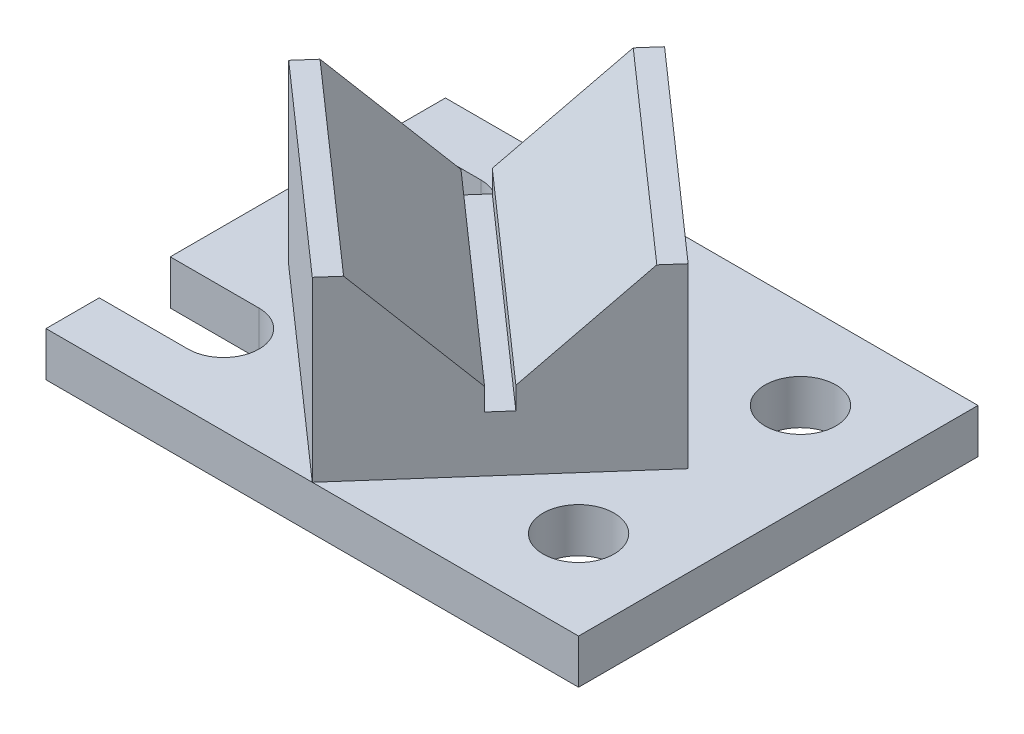
ISO-10303-21;
HEADER;
FILE_DESCRIPTION(('STEP AP214'),'2;1');
FILE_NAME('part.step','',(''),(''),'','','');
FILE_SCHEMA(('AUTOMOTIVE_DESIGN { 1 0 10303 214 1 1 1 1 }'));
ENDSEC;
DATA;
#1=APPLICATION_CONTEXT('core data for automotive mechanical design processes');
#2=APPLICATION_PROTOCOL_DEFINITION('international standard','automotive_design',2000,#1);
#3=PRODUCT_CONTEXT('',#1,'mechanical');
#4=PRODUCT('Part','Part','',(#3));
#5=PRODUCT_RELATED_PRODUCT_CATEGORY('part','',(#4));
#6=PRODUCT_DEFINITION_FORMATION('','',#4);
#7=PRODUCT_DEFINITION_CONTEXT('part definition',#1,'design');
#8=PRODUCT_DEFINITION('design','',#6,#7);
#9=PRODUCT_DEFINITION_SHAPE('','',#8);
#10=(LENGTH_UNIT() NAMED_UNIT(*) SI_UNIT(.MILLI.,.METRE.));
#11=(NAMED_UNIT(*) PLANE_ANGLE_UNIT() SI_UNIT($,.RADIAN.));
#12=(NAMED_UNIT(*) SI_UNIT($,.STERADIAN.) SOLID_ANGLE_UNIT());
#13=UNCERTAINTY_MEASURE_WITH_UNIT(LENGTH_MEASURE(1.E-05),#10,'distance_accuracy_value','');
#14=(GEOMETRIC_REPRESENTATION_CONTEXT(3) GLOBAL_UNCERTAINTY_ASSIGNED_CONTEXT((#13)) GLOBAL_UNIT_ASSIGNED_CONTEXT((#10,
#11,#12)) REPRESENTATION_CONTEXT('',''));
#15=CARTESIAN_POINT('',(0.,0.,0.));
#16=DIRECTION('',(0.,0.,1.));
#17=DIRECTION('',(1.,0.,0.));
#18=AXIS2_PLACEMENT_3D('',#15,#16,#17);
#19=CARTESIAN_POINT('',(0.,50.8,0.));
#20=DIRECTION('',(0.,1.,0.));
#21=DIRECTION('',(0.,0.,1.));
#22=AXIS2_PLACEMENT_3D('',#19,#20,#21);
#23=PLANE('',#22);
#24=DIRECTION('',(-0.75,0.,-0.661437827766148));
#25=VECTOR('',#24,1.);
#26=CARTESIAN_POINT('',(79.5389322694655,50.8,-90.1886718568354));
#27=LINE('',#26,#25);
#28=CARTESIAN_POINT('',(122.401432269465,50.8,-52.3875));
#29=VERTEX_POINT('',#28);
#30=CARTESIAN_POINT('',(65.2514322694655,50.8,-102.78906247578));
#31=VERTEX_POINT('',#30);
#32=EDGE_CURVE('E210',#29,#31,#27,.T.);
#33=ORIENTED_EDGE('',*,*,#32,.F.);
#34=DIRECTION('',(0.661437827766148,0.,-0.75));
#35=VECTOR('',#34,1.);
#36=CARTESIAN_POINT('',(76.2,50.8,0.));
#37=LINE('',#36,#35);
#38=CARTESIAN_POINT('',(126.60156247578,50.8,-57.15));
#39=VERTEX_POINT('',#38);
#40=EDGE_CURVE('E247',#29,#39,#37,.T.);
#41=ORIENTED_EDGE('',*,*,#40,.T.);
#42=DIRECTION('',(-0.75,0.,-0.661437827766148));
#43=VECTOR('',#42,1.);
#44=CARTESIAN_POINT('',(126.60156247578,50.8,-57.15));
#45=LINE('',#44,#43);
#46=CARTESIAN_POINT('',(69.4515624757805,50.8,-107.55156247578));
#47=VERTEX_POINT('',#46);
#48=EDGE_CURVE('E246',#39,#47,#45,.T.);
#49=ORIENTED_EDGE('',*,*,#48,.T.);
#50=DIRECTION('',(-0.661437827766148,0.,0.75));
#51=VECTOR('',#50,1.);
#52=CARTESIAN_POINT('',(19.05,50.8,-50.4015624757805));
#53=LINE('',#52,#51);
#54=EDGE_CURVE('E249',#47,#31,#53,.T.);
#55=ORIENTED_EDGE('',*,*,#54,.T.);
#56=EDGE_LOOP('',(#33,#41,#49,#55));
#57=FACE_BOUND('',#56,.T.);
#58=ADVANCED_FACE('F50',(#57),#23,.T.);
#59=CARTESIAN_POINT('',(152.4,-12.7,0.));
#60=DIRECTION('',(1.,0.,0.));
#61=DIRECTION('',(0.,0.,-1.));
#62=AXIS2_PLACEMENT_3D('',#59,#60,#61);
#63=PLANE('',#62);
#64=DIRECTION('',(0.,0.,-1.));
#65=VECTOR('',#64,1.);
#66=CARTESIAN_POINT('',(152.4,0.,0.));
#67=LINE('',#66,#65);
#68=CARTESIAN_POINT('',(152.4,0.,0.));
#69=VERTEX_POINT('',#68);
#70=CARTESIAN_POINT('',(152.4,0.,-114.3));
#71=VERTEX_POINT('',#70);
#72=EDGE_CURVE('E274',#69,#71,#67,.T.);
#73=ORIENTED_EDGE('',*,*,#72,.F.);
#74=DIRECTION('',(0.,1.,0.));
#75=VECTOR('',#74,1.);
#76=CARTESIAN_POINT('',(152.4,-12.7,0.));
#77=LINE('',#76,#75);
#78=CARTESIAN_POINT('',(152.4,-12.7,0.));
#79=VERTEX_POINT('',#78);
#80=EDGE_CURVE('E344',#79,#69,#77,.T.);
#81=ORIENTED_EDGE('',*,*,#80,.F.);
#82=DIRECTION('',(0.,0.,-1.));
#83=VECTOR('',#82,1.);
#84=CARTESIAN_POINT('',(152.4,-12.7,0.));
#85=LINE('',#84,#83);
#86=CARTESIAN_POINT('',(152.4,-12.7,-114.3));
#87=VERTEX_POINT('',#86);
#88=EDGE_CURVE('E275',#79,#87,#85,.T.);
#89=ORIENTED_EDGE('',*,*,#88,.T.);
#90=DIRECTION('',(0.,1.,0.));
#91=VECTOR('',#90,1.);
#92=CARTESIAN_POINT('',(152.4,-12.7,-114.3));
#93=LINE('',#92,#91);
#94=EDGE_CURVE('E310',#87,#71,#93,.T.);
#95=ORIENTED_EDGE('',*,*,#94,.T.);
#96=EDGE_LOOP('',(#73,#81,#89,#95));
#97=FACE_BOUND('',#96,.T.);
#98=ADVANCED_FACE('F52',(#97),#63,.T.);
#99=CARTESIAN_POINT('',(0.,-12.7,0.));
#100=DIRECTION('',(0.,0.,1.));
#101=DIRECTION('',(1.,0.,0.));
#102=AXIS2_PLACEMENT_3D('',#99,#100,#101);
#103=PLANE('',#102);
#104=DIRECTION('',(1.,0.,0.));
#105=VECTOR('',#104,1.);
#106=CARTESIAN_POINT('',(0.,0.,0.));
#107=LINE('',#106,#105);
#108=CARTESIAN_POINT('',(0.,0.,0.));
#109=VERTEX_POINT('',#108);
#110=CARTESIAN_POINT('',(76.2,0.,0.));
#111=VERTEX_POINT('',#110);
#112=EDGE_CURVE('E336',#109,#111,#107,.T.);
#113=ORIENTED_EDGE('',*,*,#112,.F.);
#114=DIRECTION('',(0.,1.,0.));
#115=VECTOR('',#114,1.);
#116=CARTESIAN_POINT('',(0.,-12.7,0.));
#117=LINE('',#116,#115);
#118=CARTESIAN_POINT('',(0.,-12.7,0.));
#119=VERTEX_POINT('',#118);
#120=EDGE_CURVE('E348',#119,#109,#117,.T.);
#121=ORIENTED_EDGE('',*,*,#120,.F.);
#122=DIRECTION('',(1.,0.,0.));
#123=VECTOR('',#122,1.);
#124=CARTESIAN_POINT('',(0.,-12.7,0.));
#125=LINE('',#124,#123);
#126=EDGE_CURVE('E301',#119,#79,#125,.T.);
#127=ORIENTED_EDGE('',*,*,#126,.T.);
#128=ORIENTED_EDGE('',*,*,#80,.T.);
#129=EDGE_CURVE('E339',#111,#69,#107,.T.);
#130=ORIENTED_EDGE('',*,*,#129,.F.);
#131=EDGE_LOOP('',(#113,#121,#127,#128,#130));
#132=FACE_BOUND('',#131,.T.);
#133=ADVANCED_FACE('F401',(#132),#103,.T.);
#134=CARTESIAN_POINT('',(0.,-12.7,0.));
#135=DIRECTION('',(1.,0.,0.));
#136=DIRECTION('',(0.,0.,-1.));
#137=AXIS2_PLACEMENT_3D('',#134,#135,#136);
#138=PLANE('',#137);
#139=DIRECTION('',(0.,0.,-1.));
#140=VECTOR('',#139,1.);
#141=CARTESIAN_POINT('',(0.,0.,0.));
#142=LINE('',#141,#140);
#143=CARTESIAN_POINT('',(0.,0.,-15.24));
#144=VERTEX_POINT('',#143);
#145=EDGE_CURVE('E327',#109,#144,#142,.T.);
#146=ORIENTED_EDGE('',*,*,#145,.T.);
#147=DIRECTION('',(0.,1.,0.));
#148=VECTOR('',#147,1.);
#149=CARTESIAN_POINT('',(0.,-12.7,-15.24));
#150=LINE('',#149,#148);
#151=CARTESIAN_POINT('',(0.,-12.7,-15.24));
#152=VERTEX_POINT('',#151);
#153=EDGE_CURVE('E350',#152,#144,#150,.T.);
#154=ORIENTED_EDGE('',*,*,#153,.F.);
#155=DIRECTION('',(0.,0.,-1.));
#156=VECTOR('',#155,1.);
#157=CARTESIAN_POINT('',(0.,-12.7,0.));
#158=LINE('',#157,#156);
#159=EDGE_CURVE('E292',#119,#152,#158,.T.);
#160=ORIENTED_EDGE('',*,*,#159,.F.);
#161=ORIENTED_EDGE('',*,*,#120,.T.);
#162=EDGE_LOOP('',(#146,#154,#160,#161));
#163=FACE_BOUND('',#162,.T.);
#164=ADVANCED_FACE('F429',(#163),#138,.F.);
#165=CARTESIAN_POINT('',(0.,-12.7,-15.24));
#166=DIRECTION('',(0.,0.,-1.));
#167=DIRECTION('',(-1.,0.,0.));
#168=AXIS2_PLACEMENT_3D('',#165,#166,#167);
#169=PLANE('',#168);
#170=DIRECTION('',(-1.,0.,0.));
#171=VECTOR('',#170,1.);
#172=CARTESIAN_POINT('',(0.,0.,-15.24));
#173=LINE('',#172,#171);
#174=CARTESIAN_POINT('',(25.4,0.,-15.24));
#175=VERTEX_POINT('',#174);
#176=EDGE_CURVE('E333',#175,#144,#173,.T.);
#177=ORIENTED_EDGE('',*,*,#176,.F.);
#178=DIRECTION('',(0.,1.,0.));
#179=VECTOR('',#178,1.);
#180=CARTESIAN_POINT('',(25.4,-12.7,-15.24));
#181=LINE('',#180,#179);
#182=CARTESIAN_POINT('',(25.4,-12.7,-15.24));
#183=VERTEX_POINT('',#182);
#184=EDGE_CURVE('E352',#183,#175,#181,.T.);
#185=ORIENTED_EDGE('',*,*,#184,.F.);
#186=DIRECTION('',(-1.,0.,0.));
#187=VECTOR('',#186,1.);
#188=CARTESIAN_POINT('',(0.,-12.7,-15.24));
#189=LINE('',#188,#187);
#190=EDGE_CURVE('E298',#183,#152,#189,.T.);
#191=ORIENTED_EDGE('',*,*,#190,.T.);
#192=ORIENTED_EDGE('',*,*,#153,.T.);
#193=EDGE_LOOP('',(#177,#185,#191,#192));
#194=FACE_BOUND('',#193,.T.);
#195=ADVANCED_FACE('F472',(#194),#169,.T.);
#196=CARTESIAN_POINT('',(25.4,-12.7,-25.4));
#197=DIRECTION('',(0.,1.,0.));
#198=DIRECTION('',(0.,0.,1.));
#199=AXIS2_PLACEMENT_3D('',#196,#197,#198);
#200=CYLINDRICAL_SURFACE('',#199,10.16);
#201=CARTESIAN_POINT('',(25.4,0.,-25.4));
#202=DIRECTION('',(0.,1.,0.));
#203=DIRECTION('',(0.,0.,1.));
#204=AXIS2_PLACEMENT_3D('',#201,#202,#203);
#205=CIRCLE('',#204,10.16);
#206=CARTESIAN_POINT('',(25.4,0.,-35.56));
#207=VERTEX_POINT('',#206);
#208=EDGE_CURVE('E330',#207,#175,#205,.F.);
#209=ORIENTED_EDGE('',*,*,#208,.F.);
#210=DIRECTION('',(0.,1.,0.));
#211=VECTOR('',#210,1.);
#212=CARTESIAN_POINT('',(25.4,-12.7,-35.56));
#213=LINE('',#212,#211);
#214=CARTESIAN_POINT('',(25.4,-12.7,-35.56));
#215=VERTEX_POINT('',#214);
#216=EDGE_CURVE('E354',#215,#207,#213,.T.);
#217=ORIENTED_EDGE('',*,*,#216,.F.);
#218=CARTESIAN_POINT('',(25.4,-12.7,-25.4));
#219=DIRECTION('',(0.,1.,0.));
#220=DIRECTION('',(0.,0.,1.));
#221=AXIS2_PLACEMENT_3D('',#218,#219,#220);
#222=CIRCLE('',#221,10.16);
#223=EDGE_CURVE('E295',#215,#183,#222,.F.);
#224=ORIENTED_EDGE('',*,*,#223,.T.);
#225=ORIENTED_EDGE('',*,*,#184,.T.);
#226=EDGE_LOOP('',(#209,#217,#224,#225));
#227=FACE_BOUND('',#226,.T.);
#228=ADVANCED_FACE('F469',(#227),#200,.F.);
#229=CARTESIAN_POINT('',(0.,-12.7,-35.56));
#230=DIRECTION('',(0.,0.,1.));
#231=DIRECTION('',(1.,0.,0.));
#232=AXIS2_PLACEMENT_3D('',#229,#230,#231);
#233=PLANE('',#232);
#234=DIRECTION('',(1.,0.,0.));
#235=VECTOR('',#234,1.);
#236=CARTESIAN_POINT('',(0.,0.,-35.56));
#237=LINE('',#236,#235);
#238=CARTESIAN_POINT('',(0.,0.,-35.56));
#239=VERTEX_POINT('',#238);
#240=EDGE_CURVE('E326',#239,#207,#237,.T.);
#241=ORIENTED_EDGE('',*,*,#240,.F.);
#242=DIRECTION('',(0.,1.,0.));
#243=VECTOR('',#242,1.);
#244=CARTESIAN_POINT('',(0.,-12.7,-35.56));
#245=LINE('',#244,#243);
#246=CARTESIAN_POINT('',(0.,-12.7,-35.56));
#247=VERTEX_POINT('',#246);
#248=EDGE_CURVE('E356',#247,#239,#245,.T.);
#249=ORIENTED_EDGE('',*,*,#248,.F.);
#250=DIRECTION('',(1.,0.,0.));
#251=VECTOR('',#250,1.);
#252=CARTESIAN_POINT('',(0.,-12.7,-35.56));
#253=LINE('',#252,#251);
#254=EDGE_CURVE('E291',#247,#215,#253,.T.);
#255=ORIENTED_EDGE('',*,*,#254,.T.);
#256=ORIENTED_EDGE('',*,*,#216,.T.);
#257=EDGE_LOOP('',(#241,#249,#255,#256));
#258=FACE_BOUND('',#257,.T.);
#259=ADVANCED_FACE('F465',(#258),#233,.T.);
#260=CARTESIAN_POINT('',(0.,0.,-78.74));
#261=VERTEX_POINT('',#260);
#262=EDGE_CURVE('E324',#239,#261,#142,.T.);
#263=ORIENTED_EDGE('',*,*,#262,.T.);
#264=DIRECTION('',(0.,1.,0.));
#265=VECTOR('',#264,1.);
#266=CARTESIAN_POINT('',(0.,-12.7,-78.74));
#267=LINE('',#266,#265);
#268=CARTESIAN_POINT('',(0.,-12.7,-78.74));
#269=VERTEX_POINT('',#268);
#270=EDGE_CURVE('E358',#269,#261,#267,.T.);
#271=ORIENTED_EDGE('',*,*,#270,.F.);
#272=EDGE_CURVE('E289',#247,#269,#158,.T.);
#273=ORIENTED_EDGE('',*,*,#272,.F.);
#274=ORIENTED_EDGE('',*,*,#248,.T.);
#275=EDGE_LOOP('',(#263,#271,#273,#274));
#276=FACE_BOUND('',#275,.T.);
#277=ADVANCED_FACE('F461',(#276),#138,.F.);
#278=CARTESIAN_POINT('',(0.,-12.7,-78.74));
#279=DIRECTION('',(0.,0.,1.));
#280=DIRECTION('',(1.,0.,0.));
#281=AXIS2_PLACEMENT_3D('',#278,#279,#280);
#282=PLANE('',#281);
#283=DIRECTION('',(1.,0.,0.));
#284=VECTOR('',#283,1.);
#285=CARTESIAN_POINT('',(0.,0.,-78.74));
#286=LINE('',#285,#284);
#287=CARTESIAN_POINT('',(25.4,0.,-78.74));
#288=VERTEX_POINT('',#287);
#289=EDGE_CURVE('E322',#261,#288,#286,.T.);
#290=ORIENTED_EDGE('',*,*,#289,.T.);
#291=DIRECTION('',(0.,1.,0.));
#292=VECTOR('',#291,1.);
#293=CARTESIAN_POINT('',(25.4,-12.7,-78.74));
#294=LINE('',#293,#292);
#295=CARTESIAN_POINT('',(25.4,-12.7,-78.74));
#296=VERTEX_POINT('',#295);
#297=EDGE_CURVE('E361',#296,#288,#294,.T.);
#298=ORIENTED_EDGE('',*,*,#297,.F.);
#299=DIRECTION('',(1.,0.,0.));
#300=VECTOR('',#299,1.);
#301=CARTESIAN_POINT('',(0.,-12.7,-78.74));
#302=LINE('',#301,#300);
#303=EDGE_CURVE('E287',#269,#296,#302,.T.);
#304=ORIENTED_EDGE('',*,*,#303,.F.);
#305=ORIENTED_EDGE('',*,*,#270,.T.);
#306=EDGE_LOOP('',(#290,#298,#304,#305));
#307=FACE_BOUND('',#306,.T.);
#308=ADVANCED_FACE('F457',(#307),#282,.F.);
#309=CARTESIAN_POINT('',(25.4,-12.7,-88.9));
#310=DIRECTION('',(0.,1.,0.));
#311=DIRECTION('',(0.,0.,1.));
#312=AXIS2_PLACEMENT_3D('',#309,#310,#311);
#313=CYLINDRICAL_SURFACE('',#312,10.16);
#314=CARTESIAN_POINT('',(25.4,0.,-88.9));
#315=DIRECTION('',(0.,1.,0.));
#316=DIRECTION('',(0.,0.,1.));
#317=AXIS2_PLACEMENT_3D('',#314,#315,#316);
#318=CIRCLE('',#317,10.16);
#319=CARTESIAN_POINT('',(25.4,0.,-99.06));
#320=VERTEX_POINT('',#319);
#321=EDGE_CURVE('E320',#288,#320,#318,.T.);
#322=ORIENTED_EDGE('',*,*,#321,.T.);
#323=DIRECTION('',(0.,1.,0.));
#324=VECTOR('',#323,1.);
#325=CARTESIAN_POINT('',(25.4,-12.7,-99.06));
#326=LINE('',#325,#324);
#327=CARTESIAN_POINT('',(25.4,-12.7,-99.06));
#328=VERTEX_POINT('',#327);
#329=EDGE_CURVE('E364',#328,#320,#326,.T.);
#330=ORIENTED_EDGE('',*,*,#329,.F.);
#331=CARTESIAN_POINT('',(25.4,-12.7,-88.9));
#332=DIRECTION('',(0.,1.,0.));
#333=DIRECTION('',(0.,0.,1.));
#334=AXIS2_PLACEMENT_3D('',#331,#332,#333);
#335=CIRCLE('',#334,10.16);
#336=EDGE_CURVE('E285',#296,#328,#335,.T.);
#337=ORIENTED_EDGE('',*,*,#336,.F.);
#338=ORIENTED_EDGE('',*,*,#297,.T.);
#339=EDGE_LOOP('',(#322,#330,#337,#338));
#340=FACE_BOUND('',#339,.T.);
#341=ADVANCED_FACE('F452',(#340),#313,.F.);
#342=CARTESIAN_POINT('',(0.,-12.7,-99.06));
#343=DIRECTION('',(0.,0.,-1.));
#344=DIRECTION('',(-1.,0.,0.));
#345=AXIS2_PLACEMENT_3D('',#342,#343,#344);
#346=PLANE('',#345);
#347=DIRECTION('',(-1.,0.,0.));
#348=VECTOR('',#347,1.);
#349=CARTESIAN_POINT('',(0.,0.,-99.06));
#350=LINE('',#349,#348);
#351=CARTESIAN_POINT('',(0.,0.,-99.06));
#352=VERTEX_POINT('',#351);
#353=EDGE_CURVE('E318',#320,#352,#350,.T.);
#354=ORIENTED_EDGE('',*,*,#353,.T.);
#355=DIRECTION('',(0.,1.,0.));
#356=VECTOR('',#355,1.);
#357=CARTESIAN_POINT('',(0.,-12.7,-99.06));
#358=LINE('',#357,#356);
#359=CARTESIAN_POINT('',(0.,-12.7,-99.06));
#360=VERTEX_POINT('',#359);
#361=EDGE_CURVE('E367',#360,#352,#358,.T.);
#362=ORIENTED_EDGE('',*,*,#361,.F.);
#363=DIRECTION('',(-1.,0.,0.));
#364=VECTOR('',#363,1.);
#365=CARTESIAN_POINT('',(0.,-12.7,-99.06));
#366=LINE('',#365,#364);
#367=EDGE_CURVE('E283',#328,#360,#366,.T.);
#368=ORIENTED_EDGE('',*,*,#367,.F.);
#369=ORIENTED_EDGE('',*,*,#329,.T.);
#370=EDGE_LOOP('',(#354,#362,#368,#369));
#371=FACE_BOUND('',#370,.T.);
#372=ADVANCED_FACE('F446',(#371),#346,.F.);
#373=CARTESIAN_POINT('',(0.,-12.7,0.));
#374=DIRECTION('',(1.,0.,0.));
#375=DIRECTION('',(0.,0.,-1.));
#376=AXIS2_PLACEMENT_3D('',#373,#374,#375);
#377=PLANE('',#376);
#378=DIRECTION('',(0.,0.,-1.));
#379=VECTOR('',#378,1.);
#380=CARTESIAN_POINT('',(0.,0.,0.));
#381=LINE('',#380,#379);
#382=CARTESIAN_POINT('',(0.,0.,-114.3));
#383=VERTEX_POINT('',#382);
#384=EDGE_CURVE('E316',#352,#383,#381,.T.);
#385=ORIENTED_EDGE('',*,*,#384,.T.);
#386=DIRECTION('',(0.,1.,0.));
#387=VECTOR('',#386,1.);
#388=CARTESIAN_POINT('',(0.,-12.7,-114.3));
#389=LINE('',#388,#387);
#390=CARTESIAN_POINT('',(0.,-12.7,-114.3));
#391=VERTEX_POINT('',#390);
#392=EDGE_CURVE('E370',#391,#383,#389,.T.);
#393=ORIENTED_EDGE('',*,*,#392,.F.);
#394=DIRECTION('',(0.,0.,-1.));
#395=VECTOR('',#394,1.);
#396=CARTESIAN_POINT('',(0.,-12.7,0.));
#397=LINE('',#396,#395);
#398=EDGE_CURVE('E281',#360,#391,#397,.T.);
#399=ORIENTED_EDGE('',*,*,#398,.F.);
#400=ORIENTED_EDGE('',*,*,#361,.T.);
#401=EDGE_LOOP('',(#385,#393,#399,#400));
#402=FACE_BOUND('',#401,.T.);
#403=ADVANCED_FACE('F442',(#402),#377,.F.);
#404=CARTESIAN_POINT('',(127.,-12.7,-25.4));
#405=DIRECTION('',(0.,1.,0.));
#406=DIRECTION('',(0.,0.,1.));
#407=AXIS2_PLACEMENT_3D('',#404,#405,#406);
#408=CYLINDRICAL_SURFACE('',#407,10.16);
#409=CARTESIAN_POINT('',(127.,-12.7,-25.4));
#410=DIRECTION('',(0.,1.,0.));
#411=DIRECTION('',(0.,0.,1.));
#412=AXIS2_PLACEMENT_3D('',#409,#410,#411);
#413=CIRCLE('',#412,10.16);
#414=CARTESIAN_POINT('',(127.,-12.7,-15.24));
#415=VERTEX_POINT('',#414);
#416=EDGE_CURVE('E304',#415,#415,#413,.T.);
#417=ORIENTED_EDGE('',*,*,#416,.F.);
#418=EDGE_LOOP('',(#417));
#419=FACE_BOUND('',#418,.T.);
#420=CARTESIAN_POINT('',(127.,0.,-25.4));
#421=DIRECTION('',(0.,1.,0.));
#422=DIRECTION('',(0.,0.,1.));
#423=AXIS2_PLACEMENT_3D('',#420,#421,#422);
#424=CIRCLE('',#423,10.16);
#425=CARTESIAN_POINT('',(127.,0.,-15.24));
#426=VERTEX_POINT('',#425);
#427=EDGE_CURVE('E338',#426,#426,#424,.T.);
#428=ORIENTED_EDGE('',*,*,#427,.T.);
#429=EDGE_LOOP('',(#428));
#430=FACE_BOUND('',#429,.T.);
#431=ADVANCED_FACE('F500',(#419,#430),#408,.F.);
#432=CARTESIAN_POINT('',(0.,-12.7,-114.3));
#433=DIRECTION('',(0.,0.,1.));
#434=DIRECTION('',(1.,0.,0.));
#435=AXIS2_PLACEMENT_3D('',#432,#433,#434);
#436=PLANE('',#435);
#437=DIRECTION('',(1.,0.,0.));
#438=VECTOR('',#437,1.);
#439=CARTESIAN_POINT('',(0.,0.,-114.3));
#440=LINE('',#439,#438);
#441=EDGE_CURVE('E313',#383,#71,#440,.T.);
#442=ORIENTED_EDGE('',*,*,#441,.T.);
#443=ORIENTED_EDGE('',*,*,#94,.F.);
#444=DIRECTION('',(1.,0.,0.));
#445=VECTOR('',#444,1.);
#446=CARTESIAN_POINT('',(0.,-12.7,-114.3));
#447=LINE('',#446,#445);
#448=EDGE_CURVE('E278',#391,#87,#447,.T.);
#449=ORIENTED_EDGE('',*,*,#448,.F.);
#450=ORIENTED_EDGE('',*,*,#392,.T.);
#451=EDGE_LOOP('',(#442,#443,#449,#450));
#452=FACE_BOUND('',#451,.T.);
#453=ADVANCED_FACE('F437',(#452),#436,.F.);
#454=CARTESIAN_POINT('',(127.,-12.7,-88.9));
#455=DIRECTION('',(0.,1.,0.));
#456=DIRECTION('',(0.,0.,1.));
#457=AXIS2_PLACEMENT_3D('',#454,#455,#456);
#458=CYLINDRICAL_SURFACE('',#457,10.16);
#459=CARTESIAN_POINT('',(127.,-12.7,-88.9));
#460=DIRECTION('',(0.,1.,0.));
#461=DIRECTION('',(0.,0.,1.));
#462=AXIS2_PLACEMENT_3D('',#459,#460,#461);
#463=CIRCLE('',#462,10.16);
#464=CARTESIAN_POINT('',(127.,-12.7,-78.74));
#465=VERTEX_POINT('',#464);
#466=EDGE_CURVE('E307',#465,#465,#463,.T.);
#467=ORIENTED_EDGE('',*,*,#466,.F.);
#468=EDGE_LOOP('',(#467));
#469=FACE_BOUND('',#468,.T.);
#470=CARTESIAN_POINT('',(127.,0.,-88.9));
#471=DIRECTION('',(0.,1.,0.));
#472=DIRECTION('',(0.,0.,1.));
#473=AXIS2_PLACEMENT_3D('',#470,#471,#472);
#474=CIRCLE('',#473,10.16);
#475=CARTESIAN_POINT('',(127.,0.,-78.74));
#476=VERTEX_POINT('',#475);
#477=EDGE_CURVE('E279',#476,#476,#474,.T.);
#478=ORIENTED_EDGE('',*,*,#477,.T.);
#479=EDGE_LOOP('',(#478));
#480=FACE_BOUND('',#479,.T.);
#481=ADVANCED_FACE('F482',(#469,#480),#458,.F.);
#482=CARTESIAN_POINT('',(0.,-12.7,0.));
#483=DIRECTION('',(0.,1.,0.));
#484=DIRECTION('',(0.,0.,1.));
#485=AXIS2_PLACEMENT_3D('',#482,#483,#484);
#486=PLANE('',#485);
#487=ORIENTED_EDGE('',*,*,#88,.F.);
#488=ORIENTED_EDGE('',*,*,#126,.F.);
#489=ORIENTED_EDGE('',*,*,#159,.T.);
#490=ORIENTED_EDGE('',*,*,#190,.F.);
#491=ORIENTED_EDGE('',*,*,#223,.F.);
#492=ORIENTED_EDGE('',*,*,#254,.F.);
#493=ORIENTED_EDGE('',*,*,#272,.T.);
#494=ORIENTED_EDGE('',*,*,#303,.T.);
#495=ORIENTED_EDGE('',*,*,#336,.T.);
#496=ORIENTED_EDGE('',*,*,#367,.T.);
#497=ORIENTED_EDGE('',*,*,#398,.T.);
#498=ORIENTED_EDGE('',*,*,#448,.T.);
#499=EDGE_LOOP('',(#487,#488,#489,#490,#491,#492,#493,#494,#495,#496,#497,#498));
#500=FACE_BOUND('',#499,.T.);
#501=ORIENTED_EDGE('',*,*,#416,.T.);
#502=EDGE_LOOP('',(#501));
#503=FACE_BOUND('',#502,.T.);
#504=ORIENTED_EDGE('',*,*,#466,.T.);
#505=EDGE_LOOP('',(#504));
#506=FACE_BOUND('',#505,.T.);
#507=ADVANCED_FACE('F479',(#500,#503,#506),#486,.F.);
#508=CARTESIAN_POINT('',(0.,0.,0.));
#509=DIRECTION('',(0.,1.,0.));
#510=DIRECTION('',(0.,0.,1.));
#511=AXIS2_PLACEMENT_3D('',#508,#509,#510);
#512=PLANE('',#511);
#513=DIRECTION('',(0.661437827766148,0.,-0.75));
#514=VECTOR('',#513,1.);
#515=CARTESIAN_POINT('',(76.2,0.,0.));
#516=LINE('',#515,#514);
#517=CARTESIAN_POINT('',(126.60156247578,0.,-57.15));
#518=VERTEX_POINT('',#517);
#519=EDGE_CURVE('E242',#111,#518,#516,.T.);
#520=ORIENTED_EDGE('',*,*,#519,.F.);
#521=ORIENTED_EDGE('',*,*,#129,.T.);
#522=ORIENTED_EDGE('',*,*,#72,.T.);
#523=ORIENTED_EDGE('',*,*,#441,.F.);
#524=ORIENTED_EDGE('',*,*,#384,.F.);
#525=ORIENTED_EDGE('',*,*,#353,.F.);
#526=ORIENTED_EDGE('',*,*,#321,.F.);
#527=ORIENTED_EDGE('',*,*,#289,.F.);
#528=ORIENTED_EDGE('',*,*,#262,.F.);
#529=ORIENTED_EDGE('',*,*,#240,.T.);
#530=ORIENTED_EDGE('',*,*,#208,.T.);
#531=ORIENTED_EDGE('',*,*,#176,.T.);
#532=ORIENTED_EDGE('',*,*,#145,.F.);
#533=ORIENTED_EDGE('',*,*,#112,.T.);
#534=DIRECTION('',(0.749999999999999,0.,0.661437827766148));
#535=VECTOR('',#534,1.);
#536=CARTESIAN_POINT('',(76.2,0.,0.));
#537=LINE('',#536,#535);
#538=CARTESIAN_POINT('',(19.05,0.,-50.4015624757805));
#539=VERTEX_POINT('',#538);
#540=EDGE_CURVE('E73',#539,#111,#537,.T.);
#541=ORIENTED_EDGE('',*,*,#540,.F.);
#542=DIRECTION('',(-0.661437827766148,0.,0.75));
#543=VECTOR('',#542,1.);
#544=CARTESIAN_POINT('',(19.05,0.,-50.4015624757805));
#545=LINE('',#544,#543);
#546=CARTESIAN_POINT('',(69.4515624757805,0.,-107.55156247578));
#547=VERTEX_POINT('',#546);
#548=EDGE_CURVE('E260',#547,#539,#545,.T.);
#549=ORIENTED_EDGE('',*,*,#548,.F.);
#550=DIRECTION('',(-0.75,0.,-0.661437827766148));
#551=VECTOR('',#550,1.);
#552=CARTESIAN_POINT('',(126.60156247578,0.,-57.15));
#553=LINE('',#552,#551);
#554=EDGE_CURVE('E257',#518,#547,#553,.T.);
#555=ORIENTED_EDGE('',*,*,#554,.F.);
#556=EDGE_LOOP('',(#520,#521,#522,#523,#524,#525,#526,#527,#528,#529,#530,#531,#532,#533,#541,
#549,#555));
#557=FACE_BOUND('',#556,.T.);
#558=ORIENTED_EDGE('',*,*,#427,.F.);
#559=EDGE_LOOP('',(#558));
#560=FACE_BOUND('',#559,.T.);
#561=ORIENTED_EDGE('',*,*,#477,.F.);
#562=EDGE_LOOP('',(#561));
#563=FACE_BOUND('',#562,.T.);
#564=ADVANCED_FACE('F396',(#557,#560,#563),#512,.T.);
#565=CARTESIAN_POINT('',(76.2,50.8,0.));
#566=DIRECTION('',(-0.75,0.,-0.661437827766148));
#567=DIRECTION('',(-0.661437827766148,0.,0.75));
#568=AXIS2_PLACEMENT_3D('',#565,#566,#567);
#569=PLANE('',#568);
#570=ORIENTED_EDGE('',*,*,#40,.F.);
#571=DIRECTION('',(-0.467707173346739,-0.707106781186554,0.530330085889906));
#572=VECTOR('',#571,1.);
#573=CARTESIAN_POINT('',(99.3007161347331,15.875,-26.1937500000005));
#574=LINE('',#573,#572);
#575=CARTESIAN_POINT('',(103.500846341048,22.2249999999997,-30.9562500000002));
#576=VERTEX_POINT('',#575);
#577=EDGE_CURVE('E231',#29,#576,#574,.T.);
#578=ORIENTED_EDGE('',*,*,#577,.T.);
#579=DIRECTION('',(0.,-1.,0.));
#580=VECTOR('',#579,1.);
#581=CARTESIAN_POINT('',(103.500846341049,50.7999999999987,-30.9562500000009));
#582=LINE('',#581,#580);
#583=CARTESIAN_POINT('',(103.500846341048,15.875,-30.95625));
#584=VERTEX_POINT('',#583);
#585=EDGE_CURVE('E239',#576,#584,#582,.T.);
#586=ORIENTED_EDGE('',*,*,#585,.T.);
#587=DIRECTION('',(-0.661437827766148,0.,0.75));
#588=VECTOR('',#587,1.);
#589=CARTESIAN_POINT('',(76.2,15.875,0.));
#590=LINE('',#589,#588);
#591=CARTESIAN_POINT('',(99.3007161347327,15.875,-26.19375));
#592=VERTEX_POINT('',#591);
#593=EDGE_CURVE('E236',#584,#592,#590,.T.);
#594=ORIENTED_EDGE('',*,*,#593,.T.);
#595=DIRECTION('',(0.,1.,0.));
#596=VECTOR('',#595,1.);
#597=CARTESIAN_POINT('',(99.3007161347327,50.8,-26.19375));
#598=LINE('',#597,#596);
#599=CARTESIAN_POINT('',(99.3007161347327,22.2249999999997,-26.19375));
#600=VERTEX_POINT('',#599);
#601=EDGE_CURVE('E234',#592,#600,#598,.T.);
#602=ORIENTED_EDGE('',*,*,#601,.T.);
#603=DIRECTION('',(-0.467707173346741,0.707106781186551,0.530330085889908));
#604=VECTOR('',#603,1.);
#605=CARTESIAN_POINT('',(78.3000651031575,53.975,-2.38125000000003));
#606=LINE('',#605,#604);
#607=CARTESIAN_POINT('',(80.400130206315,50.8,-4.7625));
#608=VERTEX_POINT('',#607);
#609=EDGE_CURVE('E214',#600,#608,#606,.T.);
#610=ORIENTED_EDGE('',*,*,#609,.T.);
#611=CARTESIAN_POINT('',(76.2,50.8,0.));
#612=VERTEX_POINT('',#611);
#613=EDGE_CURVE('E243',#612,#608,#37,.T.);
#614=ORIENTED_EDGE('',*,*,#613,.F.);
#615=DIRECTION('',(0.,-1.,0.));
#616=VECTOR('',#615,1.);
#617=CARTESIAN_POINT('',(76.2,50.8,0.));
#618=LINE('',#617,#616);
#619=EDGE_CURVE('E254',#612,#111,#618,.T.);
#620=ORIENTED_EDGE('',*,*,#619,.T.);
#621=ORIENTED_EDGE('',*,*,#519,.T.);
#622=DIRECTION('',(0.,-1.,0.));
#623=VECTOR('',#622,1.);
#624=CARTESIAN_POINT('',(126.60156247578,50.8,-57.15));
#625=LINE('',#624,#623);
#626=EDGE_CURVE('E271',#39,#518,#625,.T.);
#627=ORIENTED_EDGE('',*,*,#626,.F.);
#628=EDGE_LOOP('',(#570,#578,#586,#594,#602,#610,#614,#620,#621,#627));
#629=FACE_BOUND('',#628,.T.);
#630=ADVANCED_FACE('F385',(#629),#569,.F.);
#631=CARTESIAN_POINT('',(126.60156247578,50.8,-57.15));
#632=DIRECTION('',(-0.661437827766148,0.,0.75));
#633=DIRECTION('',(0.75,0.,0.661437827766148));
#634=AXIS2_PLACEMENT_3D('',#631,#632,#633);
#635=PLANE('',#634);
#636=ORIENTED_EDGE('',*,*,#554,.T.);
#637=DIRECTION('',(0.,-1.,0.));
#638=VECTOR('',#637,1.);
#639=CARTESIAN_POINT('',(69.4515624757805,50.8,-107.55156247578));
#640=LINE('',#639,#638);
#641=EDGE_CURVE('E268',#47,#547,#640,.T.);
#642=ORIENTED_EDGE('',*,*,#641,.F.);
#643=ORIENTED_EDGE('',*,*,#48,.F.);
#644=ORIENTED_EDGE('',*,*,#626,.T.);
#645=EDGE_LOOP('',(#636,#642,#643,#644));
#646=FACE_BOUND('',#645,.T.);
#647=ADVANCED_FACE('F395',(#646),#635,.F.);
#648=CARTESIAN_POINT('',(19.05,50.8,-50.4015624757805));
#649=DIRECTION('',(0.75,0.,0.661437827766148));
#650=DIRECTION('',(0.661437827766148,0.,-0.75));
#651=AXIS2_PLACEMENT_3D('',#648,#649,#650);
#652=PLANE('',#651);
#653=DIRECTION('',(0.,1.,0.));
#654=VECTOR('',#653,1.);
#655=CARTESIAN_POINT('',(46.3508463410485,50.7999999999987,-81.3578124757813));
#656=LINE('',#655,#654);
#657=CARTESIAN_POINT('',(46.3508463410478,15.875,-81.3578124757805));
#658=VERTEX_POINT('',#657);
#659=CARTESIAN_POINT('',(46.3508463410479,22.2249999999997,-81.3578124757806));
#660=VERTEX_POINT('',#659);
#661=EDGE_CURVE('E13',#658,#660,#656,.T.);
#662=ORIENTED_EDGE('',*,*,#661,.T.);
#663=DIRECTION('',(0.467707173346739,0.707106781186554,-0.530330085889906));
#664=VECTOR('',#663,1.);
#665=CARTESIAN_POINT('',(42.1507161347331,15.875,-76.595312475781));
#666=LINE('',#665,#664);
#667=EDGE_CURVE('E222',#660,#31,#666,.T.);
#668=ORIENTED_EDGE('',*,*,#667,.T.);
#669=ORIENTED_EDGE('',*,*,#54,.F.);
#670=ORIENTED_EDGE('',*,*,#641,.T.);
#671=ORIENTED_EDGE('',*,*,#548,.T.);
#672=DIRECTION('',(0.,-1.,0.));
#673=VECTOR('',#672,1.);
#674=CARTESIAN_POINT('',(19.05,50.8,-50.4015624757805));
#675=LINE('',#674,#673);
#676=CARTESIAN_POINT('',(19.05,50.8,-50.4015624757805));
#677=VERTEX_POINT('',#676);
#678=EDGE_CURVE('E265',#677,#539,#675,.T.);
#679=ORIENTED_EDGE('',*,*,#678,.F.);
#680=CARTESIAN_POINT('',(23.250130206315,50.8,-55.1640624757805));
#681=VERTEX_POINT('',#680);
#682=EDGE_CURVE('E219',#681,#677,#53,.T.);
#683=ORIENTED_EDGE('',*,*,#682,.F.);
#684=DIRECTION('',(0.46770717334674,-0.707106781186551,-0.530330085889908));
#685=VECTOR('',#684,1.);
#686=CARTESIAN_POINT('',(21.1500651031576,53.975,-52.7828124757805));
#687=LINE('',#686,#685);
#688=CARTESIAN_POINT('',(42.1507161347327,22.2249999999997,-76.5953124757805));
#689=VERTEX_POINT('',#688);
#690=EDGE_CURVE('E65',#681,#689,#687,.T.);
#691=ORIENTED_EDGE('',*,*,#690,.T.);
#692=DIRECTION('',(0.,-1.,0.));
#693=VECTOR('',#692,1.);
#694=CARTESIAN_POINT('',(42.1507161347327,50.8,-76.5953124757805));
#695=LINE('',#694,#693);
#696=CARTESIAN_POINT('',(42.1507161347327,15.875,-76.5953124757805));
#697=VERTEX_POINT('',#696);
#698=EDGE_CURVE('E202',#689,#697,#695,.T.);
#699=ORIENTED_EDGE('',*,*,#698,.T.);
#700=DIRECTION('',(0.661437827766148,0.,-0.75));
#701=VECTOR('',#700,1.);
#702=CARTESIAN_POINT('',(19.05,15.875,-50.4015624757805));
#703=LINE('',#702,#701);
#704=EDGE_CURVE('E58',#697,#658,#703,.T.);
#705=ORIENTED_EDGE('',*,*,#704,.T.);
#706=EDGE_LOOP('',(#662,#668,#669,#670,#671,#679,#683,#691,#699,#705));
#707=FACE_BOUND('',#706,.T.);
#708=ADVANCED_FACE('F217',(#707),#652,.F.);
#709=CARTESIAN_POINT('',(76.2,50.8,0.));
#710=DIRECTION('',(0.661437827766148,0.,-0.75));
#711=DIRECTION('',(-0.75,0.,-0.661437827766148));
#712=AXIS2_PLACEMENT_3D('',#709,#710,#711);
#713=PLANE('',#712);
#714=ORIENTED_EDGE('',*,*,#540,.T.);
#715=ORIENTED_EDGE('',*,*,#619,.F.);
#716=DIRECTION('',(0.749999999999999,0.,0.661437827766148));
#717=VECTOR('',#716,1.);
#718=CARTESIAN_POINT('',(76.2,50.8,0.));
#719=LINE('',#718,#717);
#720=EDGE_CURVE('E252',#677,#612,#719,.T.);
#721=ORIENTED_EDGE('',*,*,#720,.F.);
#722=ORIENTED_EDGE('',*,*,#678,.T.);
#723=EDGE_LOOP('',(#714,#715,#721,#722));
#724=FACE_BOUND('',#723,.T.);
#725=ADVANCED_FACE('F407',(#724),#713,.F.);
#726=DIRECTION('',(0.75,0.,0.661437827766148));
#727=VECTOR('',#726,1.);
#728=CARTESIAN_POINT('',(37.5376302063151,50.8,-42.5636718568353));
#729=LINE('',#728,#727);
#730=EDGE_CURVE('E347',#681,#608,#729,.T.);
#731=ORIENTED_EDGE('',*,*,#730,.F.);
#732=ORIENTED_EDGE('',*,*,#682,.T.);
#733=ORIENTED_EDGE('',*,*,#720,.T.);
#734=ORIENTED_EDGE('',*,*,#613,.T.);
#735=EDGE_LOOP('',(#731,#732,#733,#734));
#736=FACE_BOUND('',#735,.T.);
#737=ADVANCED_FACE('F411',(#736),#23,.T.);
#738=CARTESIAN_POINT('',(3.9365885557949,22.2249999999997,-118.763671856836));
#739=DIRECTION('',(0.661437827766148,0.,-0.75));
#740=DIRECTION('',(-0.75,0.,-0.661437827766148));
#741=AXIS2_PLACEMENT_3D('',#738,#739,#740);
#742=PLANE('',#741);
#743=DIRECTION('',(0.75,0.,0.661437827766148));
#744=VECTOR('',#743,1.);
#745=CARTESIAN_POINT('',(3.9365885557949,22.2249999999997,-118.763671856836));
#746=LINE('',#745,#744);
#747=EDGE_CURVE('E220',#660,#576,#746,.T.);
#748=ORIENTED_EDGE('',*,*,#747,.F.);
#749=ORIENTED_EDGE('',*,*,#661,.F.);
#750=DIRECTION('',(0.75,0.,0.661437827766148));
#751=VECTOR('',#750,1.);
#752=CARTESIAN_POINT('',(3.93658855579476,15.875,-118.763671856835));
#753=LINE('',#752,#751);
#754=EDGE_CURVE('E225',#658,#584,#753,.T.);
#755=ORIENTED_EDGE('',*,*,#754,.T.);
#756=ORIENTED_EDGE('',*,*,#585,.F.);
#757=EDGE_LOOP('',(#748,#749,#755,#756));
#758=FACE_BOUND('',#757,.T.);
#759=ADVANCED_FACE('F382',(#758),#742,.F.);
#760=CARTESIAN_POINT('',(-0.263541650520283,15.875,-114.001171856835));
#761=DIRECTION('',(0.,-1.,0.));
#762=DIRECTION('',(0.,0.,-1.));
#763=AXIS2_PLACEMENT_3D('',#760,#761,#762);
#764=PLANE('',#763);
#765=ORIENTED_EDGE('',*,*,#754,.F.);
#766=ORIENTED_EDGE('',*,*,#704,.F.);
#767=DIRECTION('',(0.75,0.,0.661437827766148));
#768=VECTOR('',#767,1.);
#769=CARTESIAN_POINT('',(-0.263541650520283,15.875,-114.001171856835));
#770=LINE('',#769,#768);
#771=EDGE_CURVE('E207',#697,#592,#770,.T.);
#772=ORIENTED_EDGE('',*,*,#771,.T.);
#773=ORIENTED_EDGE('',*,*,#593,.F.);
#774=EDGE_LOOP('',(#765,#766,#772,#773));
#775=FACE_BOUND('',#774,.T.);
#776=ADVANCED_FACE('F377',(#775),#764,.F.);
#777=CARTESIAN_POINT('',(-0.263541650520283,22.2249999999997,-114.001171856835));
#778=DIRECTION('',(-0.661437827766148,0.,0.75));
#779=DIRECTION('',(0.75,0.,0.661437827766148));
#780=AXIS2_PLACEMENT_3D('',#777,#778,#779);
#781=PLANE('',#780);
#782=ORIENTED_EDGE('',*,*,#771,.F.);
#783=ORIENTED_EDGE('',*,*,#698,.F.);
#784=DIRECTION('',(0.75,0.,0.661437827766148));
#785=VECTOR('',#784,1.);
#786=CARTESIAN_POINT('',(-0.263541650520283,22.2249999999997,-114.001171856835));
#787=LINE('',#786,#785);
#788=EDGE_CURVE('E204',#689,#600,#787,.T.);
#789=ORIENTED_EDGE('',*,*,#788,.T.);
#790=ORIENTED_EDGE('',*,*,#601,.F.);
#791=EDGE_LOOP('',(#782,#783,#789,#790));
#792=FACE_BOUND('',#791,.T.);
#793=ADVANCED_FACE('F203',(#792),#781,.F.);
#794=CARTESIAN_POINT('',(22.8371744842125,50.8,-140.194921856835));
#795=DIRECTION('',(0.467707173346747,-0.707106781186541,-0.530330085889915));
#796=DIRECTION('',(0.,0.600000000000007,-0.799999999999995));
#797=AXIS2_PLACEMENT_3D('',#794,#795,#796);
#798=PLANE('',#797);
#799=ORIENTED_EDGE('',*,*,#32,.T.);
#800=ORIENTED_EDGE('',*,*,#667,.F.);
#801=ORIENTED_EDGE('',*,*,#747,.T.);
#802=ORIENTED_EDGE('',*,*,#577,.F.);
#803=EDGE_LOOP('',(#799,#800,#801,#802));
#804=FACE_BOUND('',#803,.T.);
#805=ADVANCED_FACE('F389',(#804),#798,.F.);
#806=CARTESIAN_POINT('',(-19.164127578938,50.8,-92.5699218568354));
#807=DIRECTION('',(-0.467707173346745,-0.707106781186544,0.530330085889913));
#808=DIRECTION('',(0.,-0.600000000000004,-0.799999999999997));
#809=AXIS2_PLACEMENT_3D('',#806,#807,#808);
#810=PLANE('',#809);
#811=ORIENTED_EDGE('',*,*,#788,.F.);
#812=ORIENTED_EDGE('',*,*,#690,.F.);
#813=ORIENTED_EDGE('',*,*,#730,.T.);
#814=ORIENTED_EDGE('',*,*,#609,.F.);
#815=EDGE_LOOP('',(#811,#812,#813,#814));
#816=FACE_BOUND('',#815,.T.);
#817=ADVANCED_FACE('F212',(#816),#810,.F.);
#818=CLOSED_SHELL('',(#58,#98,#133,#164,#195,#228,#259,#277,#308,#341,#372,#403,#431,#453,#481,
#507,#564,#630,#647,#708,#725,#737,#759,#776,#793,#805,#817));
#819=MANIFOLD_SOLID_BREP('B2',#818);
#820=ADVANCED_BREP_SHAPE_REPRESENTATION('',(#18,#819),#14);
#821=SHAPE_DEFINITION_REPRESENTATION(#9,#820);
ENDSEC;
END-ISO-10303-21;
